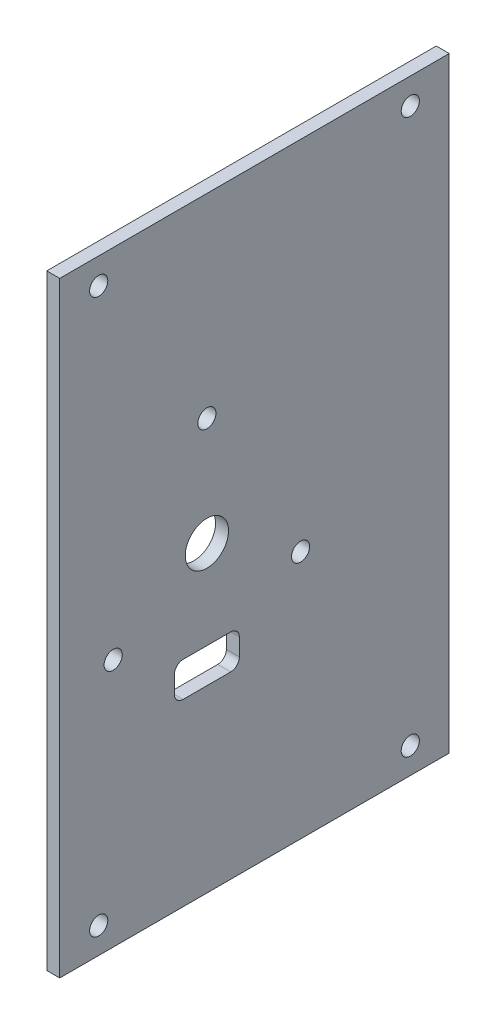
ISO-10303-21;
HEADER;
FILE_DESCRIPTION(('STEP AP214'),'2;1');
FILE_NAME('part.step','',(''),(''),'','','');
FILE_SCHEMA(('AUTOMOTIVE_DESIGN { 1 0 10303 214 1 1 1 1 }'));
ENDSEC;
DATA;
#1=APPLICATION_CONTEXT('core data for automotive mechanical design processes');
#2=APPLICATION_PROTOCOL_DEFINITION('international standard','automotive_design',2000,#1);
#3=PRODUCT_CONTEXT('',#1,'mechanical');
#4=PRODUCT('Part','Part','',(#3));
#5=PRODUCT_RELATED_PRODUCT_CATEGORY('part','',(#4));
#6=PRODUCT_DEFINITION_FORMATION('','',#4);
#7=PRODUCT_DEFINITION_CONTEXT('part definition',#1,'design');
#8=PRODUCT_DEFINITION('design','',#6,#7);
#9=PRODUCT_DEFINITION_SHAPE('','',#8);
#10=(LENGTH_UNIT() NAMED_UNIT(*) SI_UNIT(.MILLI.,.METRE.));
#11=(NAMED_UNIT(*) PLANE_ANGLE_UNIT() SI_UNIT($,.RADIAN.));
#12=(NAMED_UNIT(*) SI_UNIT($,.STERADIAN.) SOLID_ANGLE_UNIT());
#13=UNCERTAINTY_MEASURE_WITH_UNIT(LENGTH_MEASURE(1.E-05),#10,'distance_accuracy_value','');
#14=(GEOMETRIC_REPRESENTATION_CONTEXT(3) GLOBAL_UNCERTAINTY_ASSIGNED_CONTEXT((#13)) GLOBAL_UNIT_ASSIGNED_CONTEXT((#10,
#11,#12)) REPRESENTATION_CONTEXT('',''));
#15=CARTESIAN_POINT('',(0.,0.,0.));
#16=DIRECTION('',(0.,0.,1.));
#17=DIRECTION('',(1.,0.,0.));
#18=AXIS2_PLACEMENT_3D('',#15,#16,#17);
#19=CARTESIAN_POINT('',(3.,0.,0.));
#20=DIRECTION('',(1.,0.,0.));
#21=DIRECTION('',(0.,0.,-1.));
#22=AXIS2_PLACEMENT_3D('',#19,#20,#21);
#23=PLANE('',#22);
#24=CARTESIAN_POINT('',(3.,-134.,-81.));
#25=DIRECTION('',(1.,0.,0.));
#26=DIRECTION('',(0.,0.,-1.));
#27=AXIS2_PLACEMENT_3D('',#24,#25,#26);
#28=CIRCLE('',#27,2.09999999999999);
#29=CARTESIAN_POINT('',(3.,-134.,-83.1));
#30=VERTEX_POINT('',#29);
#31=EDGE_CURVE('E398',#30,#30,#28,.T.);
#32=ORIENTED_EDGE('',*,*,#31,.F.);
#33=EDGE_LOOP('',(#32));
#34=FACE_BOUND('',#33,.T.);
#35=CARTESIAN_POINT('',(3.,-6.,-9.));
#36=DIRECTION('',(1.,0.,0.));
#37=DIRECTION('',(0.,0.,-1.));
#38=AXIS2_PLACEMENT_3D('',#35,#36,#37);
#39=CIRCLE('',#38,2.1);
#40=CARTESIAN_POINT('',(3.,-6.,-11.1));
#41=VERTEX_POINT('',#40);
#42=EDGE_CURVE('E414',#41,#41,#39,.T.);
#43=ORIENTED_EDGE('',*,*,#42,.F.);
#44=EDGE_LOOP('',(#43));
#45=FACE_BOUND('',#44,.T.);
#46=CARTESIAN_POINT('',(3.,-82.5,-55.6506350946109));
#47=DIRECTION('',(1.,0.,0.));
#48=DIRECTION('',(0.,0.,-1.));
#49=AXIS2_PLACEMENT_3D('',#46,#47,#48);
#50=CIRCLE('',#49,2.1);
#51=CARTESIAN_POINT('',(3.,-82.5,-57.7506350946109));
#52=VERTEX_POINT('',#51);
#53=EDGE_CURVE('E177',#52,#52,#50,.T.);
#54=ORIENTED_EDGE('',*,*,#53,.F.);
#55=EDGE_LOOP('',(#54));
#56=FACE_BOUND('',#55,.T.);
#57=CARTESIAN_POINT('',(3.,-70.,-34.));
#58=DIRECTION('',(1.,0.,0.));
#59=DIRECTION('',(0.,0.,-1.));
#60=AXIS2_PLACEMENT_3D('',#57,#58,#59);
#61=CIRCLE('',#60,5.);
#62=CARTESIAN_POINT('',(3.,-70.,-39.));
#63=VERTEX_POINT('',#62);
#64=EDGE_CURVE('E229',#63,#63,#61,.T.);
#65=ORIENTED_EDGE('',*,*,#64,.F.);
#66=EDGE_LOOP('',(#65));
#67=FACE_BOUND('',#66,.T.);
#68=DIRECTION('',(0.,-1.,0.));
#69=VECTOR('',#68,1.);
#70=CARTESIAN_POINT('',(3.,0.,0.));
#71=LINE('',#70,#69);
#72=CARTESIAN_POINT('',(3.,0.,0.));
#73=VERTEX_POINT('',#72);
#74=CARTESIAN_POINT('',(3.,-140.,0.));
#75=VERTEX_POINT('',#74);
#76=EDGE_CURVE('E237',#73,#75,#71,.T.);
#77=ORIENTED_EDGE('',*,*,#76,.T.);
#78=DIRECTION('',(0.,0.,-1.));
#79=VECTOR('',#78,1.);
#80=CARTESIAN_POINT('',(3.,-140.,0.));
#81=LINE('',#80,#79);
#82=CARTESIAN_POINT('',(3.,-140.,-90.));
#83=VERTEX_POINT('',#82);
#84=EDGE_CURVE('E241',#75,#83,#81,.T.);
#85=ORIENTED_EDGE('',*,*,#84,.T.);
#86=DIRECTION('',(0.,1.,0.));
#87=VECTOR('',#86,1.);
#88=CARTESIAN_POINT('',(3.,0.,-90.));
#89=LINE('',#88,#87);
#90=CARTESIAN_POINT('',(3.,0.,-90.));
#91=VERTEX_POINT('',#90);
#92=EDGE_CURVE('E245',#83,#91,#89,.T.);
#93=ORIENTED_EDGE('',*,*,#92,.T.);
#94=DIRECTION('',(0.,0.,1.));
#95=VECTOR('',#94,1.);
#96=CARTESIAN_POINT('',(3.,0.,0.));
#97=LINE('',#96,#95);
#98=EDGE_CURVE('E248',#91,#73,#97,.T.);
#99=ORIENTED_EDGE('',*,*,#98,.T.);
#100=EDGE_LOOP('',(#77,#85,#93,#99));
#101=FACE_BOUND('',#100,.T.);
#102=CARTESIAN_POINT('',(3.,-45.,-34.));
#103=DIRECTION('',(1.,0.,0.));
#104=DIRECTION('',(0.,0.,-1.));
#105=AXIS2_PLACEMENT_3D('',#102,#103,#104);
#106=CIRCLE('',#105,2.1);
#107=CARTESIAN_POINT('',(3.,-45.,-36.1));
#108=VERTEX_POINT('',#107);
#109=EDGE_CURVE('E221',#108,#108,#106,.T.);
#110=ORIENTED_EDGE('',*,*,#109,.F.);
#111=EDGE_LOOP('',(#110));
#112=FACE_BOUND('',#111,.T.);
#113=CARTESIAN_POINT('',(3.,-92.5,-28.5));
#114=DIRECTION('',(1.,0.,0.));
#115=DIRECTION('',(0.,0.,1.));
#116=AXIS2_PLACEMENT_3D('',#113,#114,#115);
#117=CIRCLE('',#116,2.);
#118=CARTESIAN_POINT('',(3.,-90.5,-28.5));
#119=VERTEX_POINT('',#118);
#120=CARTESIAN_POINT('',(3.,-92.5,-26.5));
#121=VERTEX_POINT('',#120);
#122=EDGE_CURVE('E136',#119,#121,#117,.T.);
#123=ORIENTED_EDGE('',*,*,#122,.F.);
#124=DIRECTION('',(0.,0.,1.));
#125=VECTOR('',#124,1.);
#126=CARTESIAN_POINT('',(3.,-90.5,-39.5));
#127=LINE('',#126,#125);
#128=CARTESIAN_POINT('',(3.,-90.5,-39.5));
#129=VERTEX_POINT('',#128);
#130=EDGE_CURVE('E127',#129,#119,#127,.T.);
#131=ORIENTED_EDGE('',*,*,#130,.F.);
#132=CARTESIAN_POINT('',(3.,-92.5,-39.5));
#133=DIRECTION('',(1.,0.,0.));
#134=DIRECTION('',(0.,0.,1.));
#135=AXIS2_PLACEMENT_3D('',#132,#133,#134);
#136=CIRCLE('',#135,2.);
#137=CARTESIAN_POINT('',(3.,-92.5,-41.5));
#138=VERTEX_POINT('',#137);
#139=EDGE_CURVE('E171',#138,#129,#136,.T.);
#140=ORIENTED_EDGE('',*,*,#139,.F.);
#141=DIRECTION('',(0.,1.,0.));
#142=VECTOR('',#141,1.);
#143=CARTESIAN_POINT('',(3.,-96.5,-41.5));
#144=LINE('',#143,#142);
#145=CARTESIAN_POINT('',(3.,-96.5,-41.5));
#146=VERTEX_POINT('',#145);
#147=EDGE_CURVE('E168',#146,#138,#144,.T.);
#148=ORIENTED_EDGE('',*,*,#147,.F.);
#149=CARTESIAN_POINT('',(3.,-96.5,-39.5));
#150=DIRECTION('',(1.,0.,0.));
#151=DIRECTION('',(0.,0.,1.));
#152=AXIS2_PLACEMENT_3D('',#149,#150,#151);
#153=CIRCLE('',#152,2.);
#154=CARTESIAN_POINT('',(3.,-98.5,-39.5));
#155=VERTEX_POINT('',#154);
#156=EDGE_CURVE('E165',#155,#146,#153,.T.);
#157=ORIENTED_EDGE('',*,*,#156,.F.);
#158=DIRECTION('',(0.,0.,-1.));
#159=VECTOR('',#158,1.);
#160=CARTESIAN_POINT('',(3.,-98.5,-28.5));
#161=LINE('',#160,#159);
#162=CARTESIAN_POINT('',(3.,-98.5,-28.5));
#163=VERTEX_POINT('',#162);
#164=EDGE_CURVE('E162',#163,#155,#161,.T.);
#165=ORIENTED_EDGE('',*,*,#164,.F.);
#166=CARTESIAN_POINT('',(3.,-96.5,-28.5));
#167=DIRECTION('',(1.,0.,0.));
#168=DIRECTION('',(0.,0.,1.));
#169=AXIS2_PLACEMENT_3D('',#166,#167,#168);
#170=CIRCLE('',#169,2.);
#171=CARTESIAN_POINT('',(3.,-96.5,-26.5));
#172=VERTEX_POINT('',#171);
#173=EDGE_CURVE('E156',#172,#163,#170,.T.);
#174=ORIENTED_EDGE('',*,*,#173,.F.);
#175=DIRECTION('',(0.,-1.,0.));
#176=VECTOR('',#175,1.);
#177=CARTESIAN_POINT('',(3.,-92.5,-26.5));
#178=LINE('',#177,#176);
#179=EDGE_CURVE('E152',#121,#172,#178,.T.);
#180=ORIENTED_EDGE('',*,*,#179,.F.);
#181=EDGE_LOOP('',(#123,#131,#140,#148,#157,#165,#174,#180));
#182=FACE_BOUND('',#181,.T.);
#183=CARTESIAN_POINT('',(3.,-82.5,-12.3493649053891));
#184=DIRECTION('',(1.,0.,0.));
#185=DIRECTION('',(0.,0.,-1.));
#186=AXIS2_PLACEMENT_3D('',#183,#184,#185);
#187=CIRCLE('',#186,2.1);
#188=CARTESIAN_POINT('',(3.,-82.5,-14.4493649053891));
#189=VERTEX_POINT('',#188);
#190=EDGE_CURVE('E422',#189,#189,#187,.T.);
#191=ORIENTED_EDGE('',*,*,#190,.F.);
#192=EDGE_LOOP('',(#191));
#193=FACE_BOUND('',#192,.T.);
#194=CARTESIAN_POINT('',(3.,-6.,-81.));
#195=DIRECTION('',(1.,0.,0.));
#196=DIRECTION('',(0.,0.,1.));
#197=AXIS2_PLACEMENT_3D('',#194,#195,#196);
#198=CIRCLE('',#197,2.09999999999999);
#199=CARTESIAN_POINT('',(3.,-6.,-78.9));
#200=VERTEX_POINT('',#199);
#201=EDGE_CURVE('E406',#200,#200,#198,.T.);
#202=ORIENTED_EDGE('',*,*,#201,.F.);
#203=EDGE_LOOP('',(#202));
#204=FACE_BOUND('',#203,.T.);
#205=CARTESIAN_POINT('',(3.,-134.,-9.));
#206=DIRECTION('',(1.,0.,0.));
#207=DIRECTION('',(0.,0.,1.));
#208=AXIS2_PLACEMENT_3D('',#205,#206,#207);
#209=CIRCLE('',#208,2.09999999999999);
#210=CARTESIAN_POINT('',(3.,-134.,-6.90000000000001));
#211=VERTEX_POINT('',#210);
#212=EDGE_CURVE('E387',#211,#211,#209,.T.);
#213=ORIENTED_EDGE('',*,*,#212,.F.);
#214=EDGE_LOOP('',(#213));
#215=FACE_BOUND('',#214,.T.);
#216=ADVANCED_FACE('F39',(#34,#45,#56,#67,#101,#112,#182,#193,#204,#215),#23,.T.);
#217=CARTESIAN_POINT('',(0.,0.,0.));
#218=DIRECTION('',(1.,0.,0.));
#219=DIRECTION('',(0.,0.,-1.));
#220=AXIS2_PLACEMENT_3D('',#217,#218,#219);
#221=PLANE('',#220);
#222=CARTESIAN_POINT('',(0.,-45.,-34.));
#223=DIRECTION('',(1.,0.,0.));
#224=DIRECTION('',(0.,0.,-1.));
#225=AXIS2_PLACEMENT_3D('',#222,#223,#224);
#226=CIRCLE('',#225,2.1);
#227=CARTESIAN_POINT('',(0.,-45.,-36.1));
#228=VERTEX_POINT('',#227);
#229=EDGE_CURVE('E146',#228,#228,#226,.T.);
#230=ORIENTED_EDGE('',*,*,#229,.T.);
#231=EDGE_LOOP('',(#230));
#232=FACE_BOUND('',#231,.T.);
#233=CARTESIAN_POINT('',(0.,-70.,-34.));
#234=DIRECTION('',(1.,0.,0.));
#235=DIRECTION('',(0.,0.,-1.));
#236=AXIS2_PLACEMENT_3D('',#233,#234,#235);
#237=CIRCLE('',#236,5.);
#238=CARTESIAN_POINT('',(0.,-70.,-39.));
#239=VERTEX_POINT('',#238);
#240=EDGE_CURVE('E225',#239,#239,#237,.T.);
#241=ORIENTED_EDGE('',*,*,#240,.T.);
#242=EDGE_LOOP('',(#241));
#243=FACE_BOUND('',#242,.T.);
#244=DIRECTION('',(0.,-1.,0.));
#245=VECTOR('',#244,1.);
#246=CARTESIAN_POINT('',(0.,0.,0.));
#247=LINE('',#246,#245);
#248=CARTESIAN_POINT('',(0.,0.,0.));
#249=VERTEX_POINT('',#248);
#250=CARTESIAN_POINT('',(0.,-140.,0.));
#251=VERTEX_POINT('',#250);
#252=EDGE_CURVE('E233',#249,#251,#247,.T.);
#253=ORIENTED_EDGE('',*,*,#252,.F.);
#254=DIRECTION('',(0.,0.,1.));
#255=VECTOR('',#254,1.);
#256=CARTESIAN_POINT('',(0.,0.,0.));
#257=LINE('',#256,#255);
#258=CARTESIAN_POINT('',(0.,0.,-90.));
#259=VERTEX_POINT('',#258);
#260=EDGE_CURVE('E242',#259,#249,#257,.T.);
#261=ORIENTED_EDGE('',*,*,#260,.F.);
#262=DIRECTION('',(0.,1.,0.));
#263=VECTOR('',#262,1.);
#264=CARTESIAN_POINT('',(0.,0.,-90.));
#265=LINE('',#264,#263);
#266=CARTESIAN_POINT('',(0.,-140.,-90.));
#267=VERTEX_POINT('',#266);
#268=EDGE_CURVE('E258',#267,#259,#265,.T.);
#269=ORIENTED_EDGE('',*,*,#268,.F.);
#270=DIRECTION('',(0.,0.,-1.));
#271=VECTOR('',#270,1.);
#272=CARTESIAN_POINT('',(0.,-140.,0.));
#273=LINE('',#272,#271);
#274=EDGE_CURVE('E255',#251,#267,#273,.T.);
#275=ORIENTED_EDGE('',*,*,#274,.F.);
#276=EDGE_LOOP('',(#253,#261,#269,#275));
#277=FACE_BOUND('',#276,.T.);
#278=DIRECTION('',(0.,0.,1.));
#279=VECTOR('',#278,1.);
#280=CARTESIAN_POINT('',(0.,-90.5,-34.));
#281=LINE('',#280,#279);
#282=CARTESIAN_POINT('',(0.,-90.5,-39.5));
#283=VERTEX_POINT('',#282);
#284=CARTESIAN_POINT('',(0.,-90.5,-28.5));
#285=VERTEX_POINT('',#284);
#286=EDGE_CURVE('E174',#283,#285,#281,.T.);
#287=ORIENTED_EDGE('',*,*,#286,.T.);
#288=CARTESIAN_POINT('',(0.,-92.5,-28.5));
#289=DIRECTION('',(1.,0.,0.));
#290=DIRECTION('',(0.,0.,1.));
#291=AXIS2_PLACEMENT_3D('',#288,#289,#290);
#292=CIRCLE('',#291,2.);
#293=CARTESIAN_POINT('',(0.,-92.5,-26.5));
#294=VERTEX_POINT('',#293);
#295=EDGE_CURVE('E143',#285,#294,#292,.T.);
#296=ORIENTED_EDGE('',*,*,#295,.T.);
#297=DIRECTION('',(0.,-1.,0.));
#298=VECTOR('',#297,1.);
#299=CARTESIAN_POINT('',(0.,-92.5,-26.5));
#300=LINE('',#299,#298);
#301=CARTESIAN_POINT('',(0.,-96.5,-26.5));
#302=VERTEX_POINT('',#301);
#303=EDGE_CURVE('E180',#294,#302,#300,.T.);
#304=ORIENTED_EDGE('',*,*,#303,.T.);
#305=CARTESIAN_POINT('',(0.,-96.5,-28.5));
#306=DIRECTION('',(1.,0.,0.));
#307=DIRECTION('',(0.,0.,1.));
#308=AXIS2_PLACEMENT_3D('',#305,#306,#307);
#309=CIRCLE('',#308,2.);
#310=CARTESIAN_POINT('',(0.,-98.5,-28.5));
#311=VERTEX_POINT('',#310);
#312=EDGE_CURVE('E184',#302,#311,#309,.T.);
#313=ORIENTED_EDGE('',*,*,#312,.T.);
#314=DIRECTION('',(0.,0.,-1.));
#315=VECTOR('',#314,1.);
#316=CARTESIAN_POINT('',(0.,-98.5,-28.5));
#317=LINE('',#316,#315);
#318=CARTESIAN_POINT('',(0.,-98.5,-39.5));
#319=VERTEX_POINT('',#318);
#320=EDGE_CURVE('E188',#311,#319,#317,.T.);
#321=ORIENTED_EDGE('',*,*,#320,.T.);
#322=CARTESIAN_POINT('',(0.,-96.5,-39.5));
#323=DIRECTION('',(1.,0.,0.));
#324=DIRECTION('',(0.,0.,1.));
#325=AXIS2_PLACEMENT_3D('',#322,#323,#324);
#326=CIRCLE('',#325,2.);
#327=CARTESIAN_POINT('',(0.,-96.5,-41.5));
#328=VERTEX_POINT('',#327);
#329=EDGE_CURVE('E192',#319,#328,#326,.T.);
#330=ORIENTED_EDGE('',*,*,#329,.T.);
#331=DIRECTION('',(0.,1.,0.));
#332=VECTOR('',#331,1.);
#333=CARTESIAN_POINT('',(0.,-96.5,-41.5));
#334=LINE('',#333,#332);
#335=CARTESIAN_POINT('',(0.,-92.5,-41.5));
#336=VERTEX_POINT('',#335);
#337=EDGE_CURVE('E196',#328,#336,#334,.T.);
#338=ORIENTED_EDGE('',*,*,#337,.T.);
#339=CARTESIAN_POINT('',(0.,-92.5,-39.5));
#340=DIRECTION('',(1.,0.,0.));
#341=DIRECTION('',(0.,0.,1.));
#342=AXIS2_PLACEMENT_3D('',#339,#340,#341);
#343=CIRCLE('',#342,2.);
#344=EDGE_CURVE('E137',#336,#283,#343,.T.);
#345=ORIENTED_EDGE('',*,*,#344,.T.);
#346=EDGE_LOOP('',(#287,#296,#304,#313,#321,#330,#338,#345));
#347=FACE_BOUND('',#346,.T.);
#348=CARTESIAN_POINT('',(0.,-82.5,-55.6506350946109));
#349=DIRECTION('',(1.,0.,0.));
#350=DIRECTION('',(0.,0.,-1.));
#351=AXIS2_PLACEMENT_3D('',#348,#349,#350);
#352=CIRCLE('',#351,2.1);
#353=CARTESIAN_POINT('',(0.,-82.5,-57.7506350946109));
#354=VERTEX_POINT('',#353);
#355=EDGE_CURVE('E426',#354,#354,#352,.T.);
#356=ORIENTED_EDGE('',*,*,#355,.T.);
#357=EDGE_LOOP('',(#356));
#358=FACE_BOUND('',#357,.T.);
#359=CARTESIAN_POINT('',(0.,-82.5,-12.3493649053891));
#360=DIRECTION('',(1.,0.,0.));
#361=DIRECTION('',(0.,0.,-1.));
#362=AXIS2_PLACEMENT_3D('',#359,#360,#361);
#363=CIRCLE('',#362,2.1);
#364=CARTESIAN_POINT('',(0.,-82.5,-14.4493649053891));
#365=VERTEX_POINT('',#364);
#366=EDGE_CURVE('E418',#365,#365,#363,.T.);
#367=ORIENTED_EDGE('',*,*,#366,.T.);
#368=EDGE_LOOP('',(#367));
#369=FACE_BOUND('',#368,.T.);
#370=CARTESIAN_POINT('',(0.,-6.,-9.));
#371=DIRECTION('',(1.,0.,0.));
#372=DIRECTION('',(0.,0.,-1.));
#373=AXIS2_PLACEMENT_3D('',#370,#371,#372);
#374=CIRCLE('',#373,2.1);
#375=CARTESIAN_POINT('',(0.,-6.,-11.1));
#376=VERTEX_POINT('',#375);
#377=EDGE_CURVE('E410',#376,#376,#374,.T.);
#378=ORIENTED_EDGE('',*,*,#377,.T.);
#379=EDGE_LOOP('',(#378));
#380=FACE_BOUND('',#379,.T.);
#381=CARTESIAN_POINT('',(0.,-6.,-81.));
#382=DIRECTION('',(1.,0.,0.));
#383=DIRECTION('',(0.,0.,1.));
#384=AXIS2_PLACEMENT_3D('',#381,#382,#383);
#385=CIRCLE('',#384,2.09999999999999);
#386=CARTESIAN_POINT('',(0.,-6.,-78.9));
#387=VERTEX_POINT('',#386);
#388=EDGE_CURVE('E402',#387,#387,#385,.T.);
#389=ORIENTED_EDGE('',*,*,#388,.T.);
#390=EDGE_LOOP('',(#389));
#391=FACE_BOUND('',#390,.T.);
#392=CARTESIAN_POINT('',(0.,-134.,-81.));
#393=DIRECTION('',(1.,0.,0.));
#394=DIRECTION('',(0.,0.,-1.));
#395=AXIS2_PLACEMENT_3D('',#392,#393,#394);
#396=CIRCLE('',#395,2.09999999999999);
#397=CARTESIAN_POINT('',(0.,-134.,-83.1));
#398=VERTEX_POINT('',#397);
#399=EDGE_CURVE('E395',#398,#398,#396,.T.);
#400=ORIENTED_EDGE('',*,*,#399,.T.);
#401=EDGE_LOOP('',(#400));
#402=FACE_BOUND('',#401,.T.);
#403=CARTESIAN_POINT('',(0.,-134.,-9.));
#404=DIRECTION('',(1.,0.,0.));
#405=DIRECTION('',(0.,0.,1.));
#406=AXIS2_PLACEMENT_3D('',#403,#404,#405);
#407=CIRCLE('',#406,2.09999999999999);
#408=CARTESIAN_POINT('',(0.,-134.,-6.90000000000001));
#409=VERTEX_POINT('',#408);
#410=EDGE_CURVE('E390',#409,#409,#407,.T.);
#411=ORIENTED_EDGE('',*,*,#410,.T.);
#412=EDGE_LOOP('',(#411));
#413=FACE_BOUND('',#412,.T.);
#414=ADVANCED_FACE('F281',(#232,#243,#277,#347,#358,#369,#380,#391,#402,#413),#221,.F.);
#415=CARTESIAN_POINT('',(3.,0.,0.));
#416=DIRECTION('',(0.,0.,-1.));
#417=DIRECTION('',(0.,1.,0.));
#418=AXIS2_PLACEMENT_3D('',#415,#416,#417);
#419=PLANE('',#418);
#420=ORIENTED_EDGE('',*,*,#252,.T.);
#421=DIRECTION('',(-1.,0.,0.));
#422=VECTOR('',#421,1.);
#423=CARTESIAN_POINT('',(3.,-140.,0.));
#424=LINE('',#423,#422);
#425=EDGE_CURVE('E11',#75,#251,#424,.T.);
#426=ORIENTED_EDGE('',*,*,#425,.F.);
#427=ORIENTED_EDGE('',*,*,#76,.F.);
#428=DIRECTION('',(-1.,0.,0.));
#429=VECTOR('',#428,1.);
#430=CARTESIAN_POINT('',(3.,0.,0.));
#431=LINE('',#430,#429);
#432=EDGE_CURVE('E251',#73,#249,#431,.T.);
#433=ORIENTED_EDGE('',*,*,#432,.T.);
#434=EDGE_LOOP('',(#420,#426,#427,#433));
#435=FACE_BOUND('',#434,.T.);
#436=ADVANCED_FACE('F41',(#435),#419,.F.);
#437=CARTESIAN_POINT('',(3.,-140.,0.));
#438=DIRECTION('',(0.,1.,0.));
#439=DIRECTION('',(0.,0.,1.));
#440=AXIS2_PLACEMENT_3D('',#437,#438,#439);
#441=PLANE('',#440);
#442=ORIENTED_EDGE('',*,*,#274,.T.);
#443=DIRECTION('',(-1.,0.,0.));
#444=VECTOR('',#443,1.);
#445=CARTESIAN_POINT('',(3.,-140.,-90.));
#446=LINE('',#445,#444);
#447=EDGE_CURVE('E48',#83,#267,#446,.T.);
#448=ORIENTED_EDGE('',*,*,#447,.F.);
#449=ORIENTED_EDGE('',*,*,#84,.F.);
#450=ORIENTED_EDGE('',*,*,#425,.T.);
#451=EDGE_LOOP('',(#442,#448,#449,#450));
#452=FACE_BOUND('',#451,.T.);
#453=ADVANCED_FACE('F292',(#452),#441,.F.);
#454=CARTESIAN_POINT('',(3.,0.,-90.));
#455=DIRECTION('',(0.,0.,1.));
#456=DIRECTION('',(0.,-1.,0.));
#457=AXIS2_PLACEMENT_3D('',#454,#455,#456);
#458=PLANE('',#457);
#459=ORIENTED_EDGE('',*,*,#268,.T.);
#460=DIRECTION('',(-1.,0.,0.));
#461=VECTOR('',#460,1.);
#462=CARTESIAN_POINT('',(3.,0.,-90.));
#463=LINE('',#462,#461);
#464=EDGE_CURVE('E266',#91,#259,#463,.T.);
#465=ORIENTED_EDGE('',*,*,#464,.F.);
#466=ORIENTED_EDGE('',*,*,#92,.F.);
#467=ORIENTED_EDGE('',*,*,#447,.T.);
#468=EDGE_LOOP('',(#459,#465,#466,#467));
#469=FACE_BOUND('',#468,.T.);
#470=ADVANCED_FACE('F275',(#469),#458,.F.);
#471=CARTESIAN_POINT('',(3.,0.,0.));
#472=DIRECTION('',(0.,-1.,0.));
#473=DIRECTION('',(0.,0.,-1.));
#474=AXIS2_PLACEMENT_3D('',#471,#472,#473);
#475=PLANE('',#474);
#476=ORIENTED_EDGE('',*,*,#260,.T.);
#477=ORIENTED_EDGE('',*,*,#432,.F.);
#478=ORIENTED_EDGE('',*,*,#98,.F.);
#479=ORIENTED_EDGE('',*,*,#464,.T.);
#480=EDGE_LOOP('',(#476,#477,#478,#479));
#481=FACE_BOUND('',#480,.T.);
#482=ADVANCED_FACE('F285',(#481),#475,.F.);
#483=CARTESIAN_POINT('',(3.,-70.,-34.));
#484=DIRECTION('',(-1.,0.,0.));
#485=DIRECTION('',(0.,0.,1.));
#486=AXIS2_PLACEMENT_3D('',#483,#484,#485);
#487=CYLINDRICAL_SURFACE('',#486,5.);
#488=ORIENTED_EDGE('',*,*,#64,.T.);
#489=EDGE_LOOP('',(#488));
#490=FACE_BOUND('',#489,.T.);
#491=ORIENTED_EDGE('',*,*,#240,.F.);
#492=EDGE_LOOP('',(#491));
#493=FACE_BOUND('',#492,.T.);
#494=ADVANCED_FACE('F310',(#490,#493),#487,.F.);
#495=CARTESIAN_POINT('',(3.,-45.,-34.));
#496=DIRECTION('',(-1.,0.,0.));
#497=DIRECTION('',(0.,0.,1.));
#498=AXIS2_PLACEMENT_3D('',#495,#496,#497);
#499=CYLINDRICAL_SURFACE('',#498,2.1);
#500=ORIENTED_EDGE('',*,*,#109,.T.);
#501=EDGE_LOOP('',(#500));
#502=FACE_BOUND('',#501,.T.);
#503=ORIENTED_EDGE('',*,*,#229,.F.);
#504=EDGE_LOOP('',(#503));
#505=FACE_BOUND('',#504,.T.);
#506=ADVANCED_FACE('F317',(#502,#505),#499,.F.);
#507=CARTESIAN_POINT('',(3.,-90.5,-34.));
#508=DIRECTION('',(0.,-1.,0.));
#509=DIRECTION('',(0.,0.,-1.));
#510=AXIS2_PLACEMENT_3D('',#507,#508,#509);
#511=PLANE('',#510);
#512=ORIENTED_EDGE('',*,*,#286,.F.);
#513=DIRECTION('',(-1.,0.,0.));
#514=VECTOR('',#513,1.);
#515=CARTESIAN_POINT('',(3.,-90.5,-39.5));
#516=LINE('',#515,#514);
#517=EDGE_CURVE('E60',#129,#283,#516,.T.);
#518=ORIENTED_EDGE('',*,*,#517,.F.);
#519=ORIENTED_EDGE('',*,*,#130,.T.);
#520=DIRECTION('',(-1.,0.,0.));
#521=VECTOR('',#520,1.);
#522=CARTESIAN_POINT('',(3.,-90.5,-28.5));
#523=LINE('',#522,#521);
#524=EDGE_CURVE('E130',#119,#285,#523,.T.);
#525=ORIENTED_EDGE('',*,*,#524,.T.);
#526=EDGE_LOOP('',(#512,#518,#519,#525));
#527=FACE_BOUND('',#526,.T.);
#528=ADVANCED_FACE('F129',(#527),#511,.T.);
#529=CARTESIAN_POINT('',(3.,-92.5,-28.5));
#530=DIRECTION('',(-1.,0.,0.));
#531=DIRECTION('',(0.,0.,1.));
#532=AXIS2_PLACEMENT_3D('',#529,#530,#531);
#533=CYLINDRICAL_SURFACE('',#532,2.);
#534=ORIENTED_EDGE('',*,*,#295,.F.);
#535=ORIENTED_EDGE('',*,*,#524,.F.);
#536=ORIENTED_EDGE('',*,*,#122,.T.);
#537=DIRECTION('',(-1.,0.,0.));
#538=VECTOR('',#537,1.);
#539=CARTESIAN_POINT('',(3.,-92.5,-26.5));
#540=LINE('',#539,#538);
#541=EDGE_CURVE('E147',#121,#294,#540,.T.);
#542=ORIENTED_EDGE('',*,*,#541,.T.);
#543=EDGE_LOOP('',(#534,#535,#536,#542));
#544=FACE_BOUND('',#543,.T.);
#545=ADVANCED_FACE('F140',(#544),#533,.F.);
#546=CARTESIAN_POINT('',(3.,-92.5,-26.5));
#547=DIRECTION('',(0.,0.,-1.));
#548=DIRECTION('',(-1.,0.,0.));
#549=AXIS2_PLACEMENT_3D('',#546,#547,#548);
#550=PLANE('',#549);
#551=ORIENTED_EDGE('',*,*,#303,.F.);
#552=ORIENTED_EDGE('',*,*,#541,.F.);
#553=ORIENTED_EDGE('',*,*,#179,.T.);
#554=DIRECTION('',(-1.,0.,0.));
#555=VECTOR('',#554,1.);
#556=CARTESIAN_POINT('',(3.,-96.5,-26.5));
#557=LINE('',#556,#555);
#558=EDGE_CURVE('E216',#172,#302,#557,.T.);
#559=ORIENTED_EDGE('',*,*,#558,.T.);
#560=EDGE_LOOP('',(#551,#552,#553,#559));
#561=FACE_BOUND('',#560,.T.);
#562=ADVANCED_FACE('F336',(#561),#550,.T.);
#563=CARTESIAN_POINT('',(3.,-96.5,-28.5));
#564=DIRECTION('',(-1.,0.,0.));
#565=DIRECTION('',(0.,0.,1.));
#566=AXIS2_PLACEMENT_3D('',#563,#564,#565);
#567=CYLINDRICAL_SURFACE('',#566,2.);
#568=ORIENTED_EDGE('',*,*,#312,.F.);
#569=ORIENTED_EDGE('',*,*,#558,.F.);
#570=ORIENTED_EDGE('',*,*,#173,.T.);
#571=DIRECTION('',(-1.,0.,0.));
#572=VECTOR('',#571,1.);
#573=CARTESIAN_POINT('',(3.,-98.5,-28.5));
#574=LINE('',#573,#572);
#575=EDGE_CURVE('E213',#163,#311,#574,.T.);
#576=ORIENTED_EDGE('',*,*,#575,.T.);
#577=EDGE_LOOP('',(#568,#569,#570,#576));
#578=FACE_BOUND('',#577,.T.);
#579=ADVANCED_FACE('F339',(#578),#567,.F.);
#580=CARTESIAN_POINT('',(3.,-98.5,-28.5));
#581=DIRECTION('',(0.,1.,0.));
#582=DIRECTION('',(0.,0.,1.));
#583=AXIS2_PLACEMENT_3D('',#580,#581,#582);
#584=PLANE('',#583);
#585=ORIENTED_EDGE('',*,*,#320,.F.);
#586=ORIENTED_EDGE('',*,*,#575,.F.);
#587=ORIENTED_EDGE('',*,*,#164,.T.);
#588=DIRECTION('',(-1.,0.,0.));
#589=VECTOR('',#588,1.);
#590=CARTESIAN_POINT('',(3.,-98.5,-39.5));
#591=LINE('',#590,#589);
#592=EDGE_CURVE('E210',#155,#319,#591,.T.);
#593=ORIENTED_EDGE('',*,*,#592,.T.);
#594=EDGE_LOOP('',(#585,#586,#587,#593));
#595=FACE_BOUND('',#594,.T.);
#596=ADVANCED_FACE('F343',(#595),#584,.T.);
#597=CARTESIAN_POINT('',(3.,-96.5,-39.5));
#598=DIRECTION('',(-1.,0.,0.));
#599=DIRECTION('',(0.,0.,1.));
#600=AXIS2_PLACEMENT_3D('',#597,#598,#599);
#601=CYLINDRICAL_SURFACE('',#600,2.);
#602=ORIENTED_EDGE('',*,*,#329,.F.);
#603=ORIENTED_EDGE('',*,*,#592,.F.);
#604=ORIENTED_EDGE('',*,*,#156,.T.);
#605=DIRECTION('',(-1.,0.,0.));
#606=VECTOR('',#605,1.);
#607=CARTESIAN_POINT('',(3.,-96.5,-41.5));
#608=LINE('',#607,#606);
#609=EDGE_CURVE('E207',#146,#328,#608,.T.);
#610=ORIENTED_EDGE('',*,*,#609,.T.);
#611=EDGE_LOOP('',(#602,#603,#604,#610));
#612=FACE_BOUND('',#611,.T.);
#613=ADVANCED_FACE('F347',(#612),#601,.F.);
#614=CARTESIAN_POINT('',(3.,-96.5,-41.5));
#615=DIRECTION('',(0.,0.,1.));
#616=DIRECTION('',(0.,-1.,0.));
#617=AXIS2_PLACEMENT_3D('',#614,#615,#616);
#618=PLANE('',#617);
#619=ORIENTED_EDGE('',*,*,#337,.F.);
#620=ORIENTED_EDGE('',*,*,#609,.F.);
#621=ORIENTED_EDGE('',*,*,#147,.T.);
#622=DIRECTION('',(-1.,0.,0.));
#623=VECTOR('',#622,1.);
#624=CARTESIAN_POINT('',(3.,-92.5,-41.5));
#625=LINE('',#624,#623);
#626=EDGE_CURVE('E55',#138,#336,#625,.T.);
#627=ORIENTED_EDGE('',*,*,#626,.T.);
#628=EDGE_LOOP('',(#619,#620,#621,#627));
#629=FACE_BOUND('',#628,.T.);
#630=ADVANCED_FACE('F351',(#629),#618,.T.);
#631=CARTESIAN_POINT('',(3.,-92.5,-39.5));
#632=DIRECTION('',(-1.,0.,0.));
#633=DIRECTION('',(0.,0.,1.));
#634=AXIS2_PLACEMENT_3D('',#631,#632,#633);
#635=CYLINDRICAL_SURFACE('',#634,2.);
#636=ORIENTED_EDGE('',*,*,#344,.F.);
#637=ORIENTED_EDGE('',*,*,#626,.F.);
#638=ORIENTED_EDGE('',*,*,#139,.T.);
#639=ORIENTED_EDGE('',*,*,#517,.T.);
#640=EDGE_LOOP('',(#636,#637,#638,#639));
#641=FACE_BOUND('',#640,.T.);
#642=ADVANCED_FACE('F355',(#641),#635,.F.);
#643=CARTESIAN_POINT('',(3.,-82.5,-55.6506350946109));
#644=DIRECTION('',(-1.,0.,0.));
#645=DIRECTION('',(0.,0.,1.));
#646=AXIS2_PLACEMENT_3D('',#643,#644,#645);
#647=CYLINDRICAL_SURFACE('',#646,2.1);
#648=ORIENTED_EDGE('',*,*,#53,.T.);
#649=EDGE_LOOP('',(#648));
#650=FACE_BOUND('',#649,.T.);
#651=ORIENTED_EDGE('',*,*,#355,.F.);
#652=EDGE_LOOP('',(#651));
#653=FACE_BOUND('',#652,.T.);
#654=ADVANCED_FACE('F359',(#650,#653),#647,.F.);
#655=CARTESIAN_POINT('',(3.,-82.5,-12.3493649053891));
#656=DIRECTION('',(-1.,0.,0.));
#657=DIRECTION('',(0.,0.,1.));
#658=AXIS2_PLACEMENT_3D('',#655,#656,#657);
#659=CYLINDRICAL_SURFACE('',#658,2.1);
#660=ORIENTED_EDGE('',*,*,#190,.T.);
#661=EDGE_LOOP('',(#660));
#662=FACE_BOUND('',#661,.T.);
#663=ORIENTED_EDGE('',*,*,#366,.F.);
#664=EDGE_LOOP('',(#663));
#665=FACE_BOUND('',#664,.T.);
#666=ADVANCED_FACE('F362',(#662,#665),#659,.F.);
#667=CARTESIAN_POINT('',(3.,-6.,-9.));
#668=DIRECTION('',(-1.,0.,0.));
#669=DIRECTION('',(0.,0.,1.));
#670=AXIS2_PLACEMENT_3D('',#667,#668,#669);
#671=CYLINDRICAL_SURFACE('',#670,2.1);
#672=ORIENTED_EDGE('',*,*,#42,.T.);
#673=EDGE_LOOP('',(#672));
#674=FACE_BOUND('',#673,.T.);
#675=ORIENTED_EDGE('',*,*,#377,.F.);
#676=EDGE_LOOP('',(#675));
#677=FACE_BOUND('',#676,.T.);
#678=ADVANCED_FACE('F366',(#674,#677),#671,.F.);
#679=CARTESIAN_POINT('',(3.,-6.,-81.));
#680=DIRECTION('',(-1.,0.,0.));
#681=DIRECTION('',(0.,0.,1.));
#682=AXIS2_PLACEMENT_3D('',#679,#680,#681);
#683=CYLINDRICAL_SURFACE('',#682,2.09999999999999);
#684=ORIENTED_EDGE('',*,*,#201,.T.);
#685=EDGE_LOOP('',(#684));
#686=FACE_BOUND('',#685,.T.);
#687=ORIENTED_EDGE('',*,*,#388,.F.);
#688=EDGE_LOOP('',(#687));
#689=FACE_BOUND('',#688,.T.);
#690=ADVANCED_FACE('F370',(#686,#689),#683,.F.);
#691=CARTESIAN_POINT('',(3.,-134.,-81.));
#692=DIRECTION('',(-1.,0.,0.));
#693=DIRECTION('',(0.,0.,1.));
#694=AXIS2_PLACEMENT_3D('',#691,#692,#693);
#695=CYLINDRICAL_SURFACE('',#694,2.09999999999999);
#696=ORIENTED_EDGE('',*,*,#31,.T.);
#697=EDGE_LOOP('',(#696));
#698=FACE_BOUND('',#697,.T.);
#699=ORIENTED_EDGE('',*,*,#399,.F.);
#700=EDGE_LOOP('',(#699));
#701=FACE_BOUND('',#700,.T.);
#702=ADVANCED_FACE('F374',(#698,#701),#695,.F.);
#703=CARTESIAN_POINT('',(3.,-134.,-9.));
#704=DIRECTION('',(-1.,0.,0.));
#705=DIRECTION('',(0.,0.,1.));
#706=AXIS2_PLACEMENT_3D('',#703,#704,#705);
#707=CYLINDRICAL_SURFACE('',#706,2.09999999999999);
#708=ORIENTED_EDGE('',*,*,#212,.T.);
#709=EDGE_LOOP('',(#708));
#710=FACE_BOUND('',#709,.T.);
#711=ORIENTED_EDGE('',*,*,#410,.F.);
#712=EDGE_LOOP('',(#711));
#713=FACE_BOUND('',#712,.T.);
#714=ADVANCED_FACE('F378',(#710,#713),#707,.F.);
#715=CLOSED_SHELL('',(#216,#414,#436,#453,#470,#482,#494,#506,#528,#545,#562,#579,#596,#613,
#630,#642,#654,#666,#678,#690,#702,#714));
#716=MANIFOLD_SOLID_BREP('B2',#715);
#717=ADVANCED_BREP_SHAPE_REPRESENTATION('',(#18,#716),#14);
#718=SHAPE_DEFINITION_REPRESENTATION(#9,#717);
ENDSEC;
END-ISO-10303-21;
